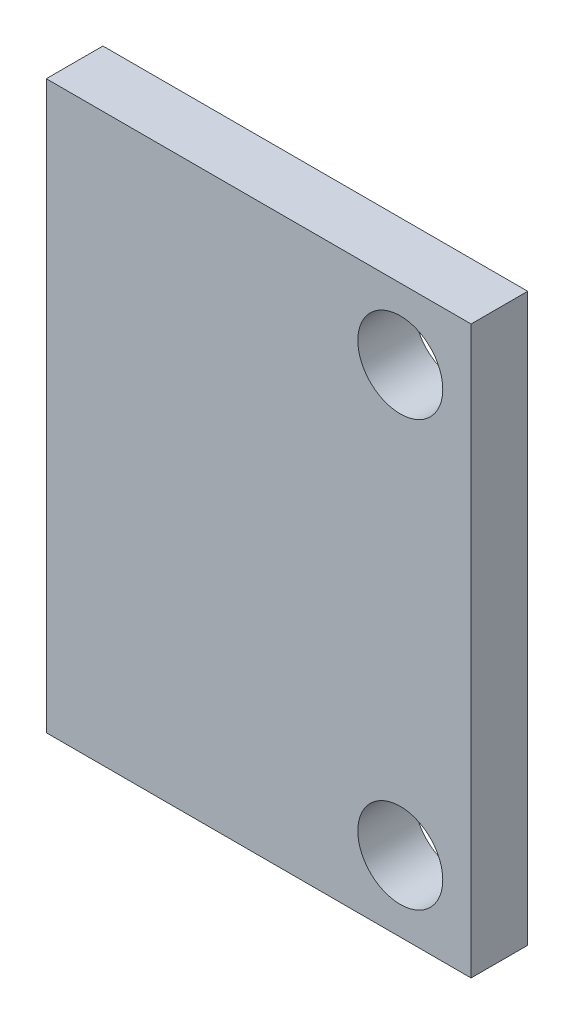
ISO-10303-21;
HEADER;
FILE_DESCRIPTION(('STEP AP214'),'2;1');
FILE_NAME('part.step','',(''),(''),'','','');
FILE_SCHEMA(('AUTOMOTIVE_DESIGN { 1 0 10303 214 1 1 1 1 }'));
ENDSEC;
DATA;
#1=APPLICATION_CONTEXT('core data for automotive mechanical design processes');
#2=APPLICATION_PROTOCOL_DEFINITION('international standard','automotive_design',2000,#1);
#3=PRODUCT_CONTEXT('',#1,'mechanical');
#4=PRODUCT('Part','Part','',(#3));
#5=PRODUCT_RELATED_PRODUCT_CATEGORY('part','',(#4));
#6=PRODUCT_DEFINITION_FORMATION('','',#4);
#7=PRODUCT_DEFINITION_CONTEXT('part definition',#1,'design');
#8=PRODUCT_DEFINITION('design','',#6,#7);
#9=PRODUCT_DEFINITION_SHAPE('','',#8);
#10=(LENGTH_UNIT() NAMED_UNIT(*) SI_UNIT(.MILLI.,.METRE.));
#11=(NAMED_UNIT(*) PLANE_ANGLE_UNIT() SI_UNIT($,.RADIAN.));
#12=(NAMED_UNIT(*) SI_UNIT($,.STERADIAN.) SOLID_ANGLE_UNIT());
#13=UNCERTAINTY_MEASURE_WITH_UNIT(LENGTH_MEASURE(1.E-05),#10,'distance_accuracy_value','');
#14=(GEOMETRIC_REPRESENTATION_CONTEXT(3) GLOBAL_UNCERTAINTY_ASSIGNED_CONTEXT((#13)) GLOBAL_UNIT_ASSIGNED_CONTEXT((#10,
#11,#12)) REPRESENTATION_CONTEXT('',''));
#15=CARTESIAN_POINT('',(0.,0.,0.));
#16=DIRECTION('',(0.,0.,1.));
#17=DIRECTION('',(1.,0.,0.));
#18=AXIS2_PLACEMENT_3D('',#15,#16,#17);
#19=CARTESIAN_POINT('',(-7.5,-10.,2.));
#20=DIRECTION('',(1.,0.,0.));
#21=DIRECTION('',(0.,0.,-1.));
#22=AXIS2_PLACEMENT_3D('',#19,#20,#21);
#23=PLANE('',#22);
#24=DIRECTION('',(0.,-1.,0.));
#25=VECTOR('',#24,1.);
#26=CARTESIAN_POINT('',(-7.5,-10.,0.));
#27=LINE('',#26,#25);
#28=CARTESIAN_POINT('',(-7.5,10.,0.));
#29=VERTEX_POINT('',#28);
#30=CARTESIAN_POINT('',(-7.5,-10.,0.));
#31=VERTEX_POINT('',#30);
#32=EDGE_CURVE('E102',#29,#31,#27,.T.);
#33=ORIENTED_EDGE('',*,*,#32,.T.);
#34=DIRECTION('',(0.,0.,-1.));
#35=VECTOR('',#34,1.);
#36=CARTESIAN_POINT('',(-7.5,-10.,2.));
#37=LINE('',#36,#35);
#38=CARTESIAN_POINT('',(-7.5,-10.,2.));
#39=VERTEX_POINT('',#38);
#40=EDGE_CURVE('E11',#39,#31,#37,.T.);
#41=ORIENTED_EDGE('',*,*,#40,.F.);
#42=DIRECTION('',(0.,-1.,0.));
#43=VECTOR('',#42,1.);
#44=CARTESIAN_POINT('',(-7.5,-10.,2.));
#45=LINE('',#44,#43);
#46=CARTESIAN_POINT('',(-7.5,10.,2.));
#47=VERTEX_POINT('',#46);
#48=EDGE_CURVE('E90',#47,#39,#45,.T.);
#49=ORIENTED_EDGE('',*,*,#48,.F.);
#50=DIRECTION('',(0.,0.,-1.));
#51=VECTOR('',#50,1.);
#52=CARTESIAN_POINT('',(-7.5,10.,2.));
#53=LINE('',#52,#51);
#54=EDGE_CURVE('E98',#47,#29,#53,.T.);
#55=ORIENTED_EDGE('',*,*,#54,.T.);
#56=EDGE_LOOP('',(#33,#41,#49,#55));
#57=FACE_BOUND('',#56,.T.);
#58=ADVANCED_FACE('F39',(#57),#23,.F.);
#59=CARTESIAN_POINT('',(7.5,-10.,2.));
#60=DIRECTION('',(0.,1.,0.));
#61=DIRECTION('',(0.,0.,1.));
#62=AXIS2_PLACEMENT_3D('',#59,#60,#61);
#63=PLANE('',#62);
#64=DIRECTION('',(1.,0.,0.));
#65=VECTOR('',#64,1.);
#66=CARTESIAN_POINT('',(7.5,-10.,0.));
#67=LINE('',#66,#65);
#68=CARTESIAN_POINT('',(7.5,-10.,0.));
#69=VERTEX_POINT('',#68);
#70=EDGE_CURVE('E94',#31,#69,#67,.T.);
#71=ORIENTED_EDGE('',*,*,#70,.T.);
#72=DIRECTION('',(0.,0.,-1.));
#73=VECTOR('',#72,1.);
#74=CARTESIAN_POINT('',(7.5,-10.,2.));
#75=LINE('',#74,#73);
#76=CARTESIAN_POINT('',(7.5,-10.,2.));
#77=VERTEX_POINT('',#76);
#78=EDGE_CURVE('E47',#77,#69,#75,.T.);
#79=ORIENTED_EDGE('',*,*,#78,.F.);
#80=DIRECTION('',(1.,0.,0.));
#81=VECTOR('',#80,1.);
#82=CARTESIAN_POINT('',(7.5,-10.,2.));
#83=LINE('',#82,#81);
#84=EDGE_CURVE('E85',#39,#77,#83,.T.);
#85=ORIENTED_EDGE('',*,*,#84,.F.);
#86=ORIENTED_EDGE('',*,*,#40,.T.);
#87=EDGE_LOOP('',(#71,#79,#85,#86));
#88=FACE_BOUND('',#87,.T.);
#89=ADVANCED_FACE('F93',(#88),#63,.F.);
#90=CARTESIAN_POINT('',(7.5,-10.,2.));
#91=DIRECTION('',(-1.,0.,0.));
#92=DIRECTION('',(0.,0.,1.));
#93=AXIS2_PLACEMENT_3D('',#90,#91,#92);
#94=PLANE('',#93);
#95=DIRECTION('',(0.,1.,0.));
#96=VECTOR('',#95,1.);
#97=CARTESIAN_POINT('',(7.5,-10.,0.));
#98=LINE('',#97,#96);
#99=CARTESIAN_POINT('',(7.5,10.,0.));
#100=VERTEX_POINT('',#99);
#101=EDGE_CURVE('E72',#69,#100,#98,.T.);
#102=ORIENTED_EDGE('',*,*,#101,.T.);
#103=DIRECTION('',(0.,0.,-1.));
#104=VECTOR('',#103,1.);
#105=CARTESIAN_POINT('',(7.5,10.,2.));
#106=LINE('',#105,#104);
#107=CARTESIAN_POINT('',(7.5,10.,2.));
#108=VERTEX_POINT('',#107);
#109=EDGE_CURVE('E95',#108,#100,#106,.T.);
#110=ORIENTED_EDGE('',*,*,#109,.F.);
#111=DIRECTION('',(0.,1.,0.));
#112=VECTOR('',#111,1.);
#113=CARTESIAN_POINT('',(7.5,-10.,2.));
#114=LINE('',#113,#112);
#115=EDGE_CURVE('E88',#77,#108,#114,.T.);
#116=ORIENTED_EDGE('',*,*,#115,.F.);
#117=ORIENTED_EDGE('',*,*,#78,.T.);
#118=EDGE_LOOP('',(#102,#110,#116,#117));
#119=FACE_BOUND('',#118,.T.);
#120=ADVANCED_FACE('F96',(#119),#94,.F.);
#121=CARTESIAN_POINT('',(7.5,10.,2.));
#122=DIRECTION('',(0.,-1.,0.));
#123=DIRECTION('',(0.,0.,-1.));
#124=AXIS2_PLACEMENT_3D('',#121,#122,#123);
#125=PLANE('',#124);
#126=DIRECTION('',(-1.,0.,0.));
#127=VECTOR('',#126,1.);
#128=CARTESIAN_POINT('',(7.5,10.,0.));
#129=LINE('',#128,#127);
#130=EDGE_CURVE('E78',#100,#29,#129,.T.);
#131=ORIENTED_EDGE('',*,*,#130,.T.);
#132=ORIENTED_EDGE('',*,*,#54,.F.);
#133=DIRECTION('',(-1.,0.,0.));
#134=VECTOR('',#133,1.);
#135=CARTESIAN_POINT('',(7.5,10.,2.));
#136=LINE('',#135,#134);
#137=EDGE_CURVE('E55',#108,#47,#136,.T.);
#138=ORIENTED_EDGE('',*,*,#137,.F.);
#139=ORIENTED_EDGE('',*,*,#109,.T.);
#140=EDGE_LOOP('',(#131,#132,#138,#139));
#141=FACE_BOUND('',#140,.T.);
#142=ADVANCED_FACE('F110',(#141),#125,.F.);
#143=CARTESIAN_POINT('',(0.,0.,2.));
#144=DIRECTION('',(0.,0.,1.));
#145=DIRECTION('',(1.,0.,0.));
#146=AXIS2_PLACEMENT_3D('',#143,#144,#145);
#147=PLANE('',#146);
#148=CARTESIAN_POINT('',(5.,7.5,2.));
#149=DIRECTION('',(0.,0.,1.));
#150=DIRECTION('',(1.,0.,0.));
#151=AXIS2_PLACEMENT_3D('',#148,#149,#150);
#152=CIRCLE('',#151,1.5);
#153=CARTESIAN_POINT('',(6.5,7.5,2.));
#154=VERTEX_POINT('',#153);
#155=EDGE_CURVE('E122',#154,#154,#152,.T.);
#156=ORIENTED_EDGE('',*,*,#155,.F.);
#157=EDGE_LOOP('',(#156));
#158=FACE_BOUND('',#157,.T.);
#159=CARTESIAN_POINT('',(5.,-7.5,2.));
#160=DIRECTION('',(0.,0.,1.));
#161=DIRECTION('',(1.,0.,0.));
#162=AXIS2_PLACEMENT_3D('',#159,#160,#161);
#163=CIRCLE('',#162,1.5);
#164=CARTESIAN_POINT('',(6.5,-7.5,2.));
#165=VERTEX_POINT('',#164);
#166=EDGE_CURVE('E119',#165,#165,#163,.T.);
#167=ORIENTED_EDGE('',*,*,#166,.F.);
#168=EDGE_LOOP('',(#167));
#169=FACE_BOUND('',#168,.T.);
#170=ORIENTED_EDGE('',*,*,#48,.T.);
#171=ORIENTED_EDGE('',*,*,#84,.T.);
#172=ORIENTED_EDGE('',*,*,#115,.T.);
#173=ORIENTED_EDGE('',*,*,#137,.T.);
#174=EDGE_LOOP('',(#170,#171,#172,#173));
#175=FACE_BOUND('',#174,.T.);
#176=ADVANCED_FACE('F86',(#158,#169,#175),#147,.T.);
#177=CARTESIAN_POINT('',(0.,0.,0.));
#178=DIRECTION('',(0.,0.,1.));
#179=DIRECTION('',(1.,0.,0.));
#180=AXIS2_PLACEMENT_3D('',#177,#178,#179);
#181=PLANE('',#180);
#182=CARTESIAN_POINT('',(5.,7.5,0.));
#183=DIRECTION('',(0.,0.,1.));
#184=DIRECTION('',(1.,0.,0.));
#185=AXIS2_PLACEMENT_3D('',#182,#183,#184);
#186=CIRCLE('',#185,1.5);
#187=CARTESIAN_POINT('',(6.5,7.5,0.));
#188=VERTEX_POINT('',#187);
#189=EDGE_CURVE('E105',#188,#188,#186,.T.);
#190=ORIENTED_EDGE('',*,*,#189,.T.);
#191=EDGE_LOOP('',(#190));
#192=FACE_BOUND('',#191,.T.);
#193=CARTESIAN_POINT('',(5.,-7.5,0.));
#194=DIRECTION('',(0.,0.,1.));
#195=DIRECTION('',(1.,0.,0.));
#196=AXIS2_PLACEMENT_3D('',#193,#194,#195);
#197=CIRCLE('',#196,1.5);
#198=CARTESIAN_POINT('',(6.5,-7.5,0.));
#199=VERTEX_POINT('',#198);
#200=EDGE_CURVE('E116',#199,#199,#197,.T.);
#201=ORIENTED_EDGE('',*,*,#200,.T.);
#202=EDGE_LOOP('',(#201));
#203=FACE_BOUND('',#202,.T.);
#204=ORIENTED_EDGE('',*,*,#32,.F.);
#205=ORIENTED_EDGE('',*,*,#130,.F.);
#206=ORIENTED_EDGE('',*,*,#101,.F.);
#207=ORIENTED_EDGE('',*,*,#70,.F.);
#208=EDGE_LOOP('',(#204,#205,#206,#207));
#209=FACE_BOUND('',#208,.T.);
#210=ADVANCED_FACE('F113',(#192,#203,#209),#181,.F.);
#211=CARTESIAN_POINT('',(5.,-7.5,0.));
#212=DIRECTION('',(0.,0.,1.));
#213=DIRECTION('',(1.,0.,0.));
#214=AXIS2_PLACEMENT_3D('',#211,#212,#213);
#215=CYLINDRICAL_SURFACE('',#214,1.5);
#216=ORIENTED_EDGE('',*,*,#200,.F.);
#217=EDGE_LOOP('',(#216));
#218=FACE_BOUND('',#217,.T.);
#219=ORIENTED_EDGE('',*,*,#166,.T.);
#220=EDGE_LOOP('',(#219));
#221=FACE_BOUND('',#220,.T.);
#222=ADVANCED_FACE('F133',(#218,#221),#215,.F.);
#223=CARTESIAN_POINT('',(5.,7.5,0.));
#224=DIRECTION('',(0.,0.,1.));
#225=DIRECTION('',(1.,0.,0.));
#226=AXIS2_PLACEMENT_3D('',#223,#224,#225);
#227=CYLINDRICAL_SURFACE('',#226,1.5);
#228=ORIENTED_EDGE('',*,*,#189,.F.);
#229=EDGE_LOOP('',(#228));
#230=FACE_BOUND('',#229,.T.);
#231=ORIENTED_EDGE('',*,*,#155,.T.);
#232=EDGE_LOOP('',(#231));
#233=FACE_BOUND('',#232,.T.);
#234=ADVANCED_FACE('F130',(#230,#233),#227,.F.);
#235=CLOSED_SHELL('',(#58,#89,#120,#142,#176,#210,#222,#234));
#236=MANIFOLD_SOLID_BREP('B2',#235);
#237=ADVANCED_BREP_SHAPE_REPRESENTATION('',(#18,#236),#14);
#238=SHAPE_DEFINITION_REPRESENTATION(#9,#237);
ENDSEC;
END-ISO-10303-21;
